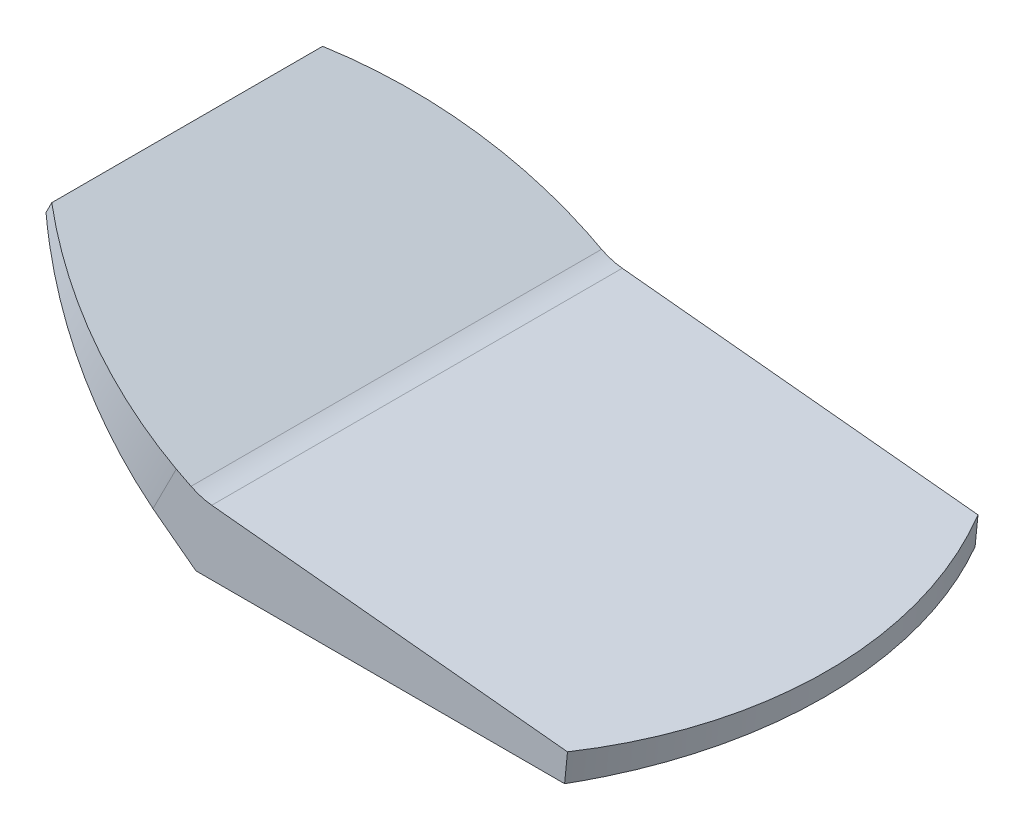
ISO-10303-21;
HEADER;
FILE_DESCRIPTION(('STEP AP214'),'2;1');
FILE_NAME('part.step','',(''),(''),'','','');
FILE_SCHEMA(('AUTOMOTIVE_DESIGN { 1 0 10303 214 1 1 1 1 }'));
ENDSEC;
DATA;
#1=APPLICATION_CONTEXT('core data for automotive mechanical design processes');
#2=APPLICATION_PROTOCOL_DEFINITION('international standard','automotive_design',2000,#1);
#3=PRODUCT_CONTEXT('',#1,'mechanical');
#4=PRODUCT('Part','Part','',(#3));
#5=PRODUCT_RELATED_PRODUCT_CATEGORY('part','',(#4));
#6=PRODUCT_DEFINITION_FORMATION('','',#4);
#7=PRODUCT_DEFINITION_CONTEXT('part definition',#1,'design');
#8=PRODUCT_DEFINITION('design','',#6,#7);
#9=PRODUCT_DEFINITION_SHAPE('','',#8);
#10=(LENGTH_UNIT() NAMED_UNIT(*) SI_UNIT(.MILLI.,.METRE.));
#11=(NAMED_UNIT(*) PLANE_ANGLE_UNIT() SI_UNIT($,.RADIAN.));
#12=(NAMED_UNIT(*) SI_UNIT($,.STERADIAN.) SOLID_ANGLE_UNIT());
#13=UNCERTAINTY_MEASURE_WITH_UNIT(LENGTH_MEASURE(1.E-05),#10,'distance_accuracy_value','');
#14=(GEOMETRIC_REPRESENTATION_CONTEXT(3) GLOBAL_UNCERTAINTY_ASSIGNED_CONTEXT((#13)) GLOBAL_UNIT_ASSIGNED_CONTEXT((#10,
#11,#12)) REPRESENTATION_CONTEXT('',''));
#15=CARTESIAN_POINT('',(0.,0.,0.));
#16=DIRECTION('',(0.,0.,1.));
#17=DIRECTION('',(1.,0.,0.));
#18=AXIS2_PLACEMENT_3D('',#15,#16,#17);
#19=CARTESIAN_POINT('',(526.236430386786,547.410087664511,-177.8));
#20=DIRECTION('',(-0.601809133316664,-0.79863994832255,0.));
#21=DIRECTION('',(0.798639948322551,-0.601809133316664,0.));
#22=AXIS2_PLACEMENT_3D('',#19,#20,#21);
#23=PLANE('',#22);
#24=DIRECTION('',(0.,0.,1.));
#25=VECTOR('',#24,1.);
#26=CARTESIAN_POINT('',(431.053198966608,619.134696642024,-177.8));
#27=LINE('',#26,#25);
#28=CARTESIAN_POINT('',(431.053198966603,619.134696642024,-147.558343712325));
#29=VERTEX_POINT('',#28);
#30=CARTESIAN_POINT('',(431.053198966603,619.134696642024,-30.2416562876749));
#31=VERTEX_POINT('',#30);
#32=EDGE_CURVE('E139',#29,#31,#27,.T.);
#33=ORIENTED_EDGE('',*,*,#32,.F.);
#34=CARTESIAN_POINT('',(510.532632695804,559.243566440573,-4.16472530347642));
#35=DIRECTION('',(-0.601809133316664,-0.79863994832255,0.));
#36=DIRECTION('',(-0.798639948322551,0.601809133316664,0.));
#37=AXIS2_PLACEMENT_3D('',#34,#35,#36);
#38=ELLIPSE('',#37,176.396794445655,173.672363457161);
#39=CARTESIAN_POINT('',(507.621316797172,561.437366664875,-177.8));
#40=VERTEX_POINT('',#39);
#41=EDGE_CURVE('E180',#29,#40,#38,.T.);
#42=ORIENTED_EDGE('',*,*,#41,.T.);
#43=DIRECTION('',(0.79863994832255,-0.601809133316664,0.));
#44=VECTOR('',#43,1.);
#45=CARTESIAN_POINT('',(526.236430386786,547.410087664511,-177.8));
#46=LINE('',#45,#44);
#47=CARTESIAN_POINT('',(526.236430386786,547.410087664511,-177.8));
#48=VERTEX_POINT('',#47);
#49=EDGE_CURVE('E167',#40,#48,#46,.T.);
#50=ORIENTED_EDGE('',*,*,#49,.T.);
#51=DIRECTION('',(0.,0.,1.));
#52=VECTOR('',#51,1.);
#53=CARTESIAN_POINT('',(526.236430386786,547.410087664511,-177.8));
#54=LINE('',#53,#52);
#55=CARTESIAN_POINT('',(526.236430386786,547.410087664511,0.));
#56=VERTEX_POINT('',#55);
#57=EDGE_CURVE('E136',#48,#56,#54,.T.);
#58=ORIENTED_EDGE('',*,*,#57,.T.);
#59=DIRECTION('',(0.79863994832255,-0.601809133316664,0.));
#60=VECTOR('',#59,1.);
#61=CARTESIAN_POINT('',(526.236430386786,547.410087664511,0.));
#62=LINE('',#61,#60);
#63=CARTESIAN_POINT('',(507.621316797171,561.437366664875,0.));
#64=VERTEX_POINT('',#63);
#65=EDGE_CURVE('E120',#64,#56,#62,.T.);
#66=ORIENTED_EDGE('',*,*,#65,.F.);
#67=CARTESIAN_POINT('',(510.532632695804,559.243566440573,-173.635274696524));
#68=DIRECTION('',(-0.601809133316664,-0.79863994832255,0.));
#69=DIRECTION('',(-0.798639948322551,0.601809133316664,0.));
#70=AXIS2_PLACEMENT_3D('',#67,#68,#69);
#71=ELLIPSE('',#70,176.396794445655,173.672363457161);
#72=EDGE_CURVE('E53',#31,#64,#71,.F.);
#73=ORIENTED_EDGE('',*,*,#72,.F.);
#74=EDGE_LOOP('',(#33,#42,#50,#58,#66,#73));
#75=FACE_BOUND('',#74,.T.);
#76=ADVANCED_FACE('F31',(#75),#23,.T.);
#77=CARTESIAN_POINT('',(433.551122257114,624.054848577868,-177.8));
#78=DIRECTION('',(-0.89166676925813,0.45269235977733,0.));
#79=DIRECTION('',(-0.45269235977733,-0.891666769258131,0.));
#80=AXIS2_PLACEMENT_3D('',#77,#78,#79);
#81=PLANE('',#80);
#82=DIRECTION('',(0.,0.,1.));
#83=VECTOR('',#82,1.);
#84=CARTESIAN_POINT('',(433.551122257114,624.054848577868,-177.8));
#85=LINE('',#84,#83);
#86=CARTESIAN_POINT('',(433.551122257114,624.054848577869,-147.558343712329));
#87=VERTEX_POINT('',#86);
#88=CARTESIAN_POINT('',(433.551122257114,624.054848577868,-30.2416562876715));
#89=VERTEX_POINT('',#88);
#90=EDGE_CURVE('E114',#87,#89,#85,.T.);
#91=ORIENTED_EDGE('',*,*,#90,.F.);
#92=DIRECTION('',(0.45269235977723,0.891666769258181,0.));
#93=VECTOR('',#92,1.);
#94=CARTESIAN_POINT('',(413.428946865017,584.420260684355,-147.558343712325));
#95=LINE('',#94,#93);
#96=EDGE_CURVE('E182',#87,#29,#95,.F.);
#97=ORIENTED_EDGE('',*,*,#96,.T.);
#98=ORIENTED_EDGE('',*,*,#32,.T.);
#99=DIRECTION('',(0.45269235977723,0.891666769258181,0.));
#100=VECTOR('',#99,1.);
#101=CARTESIAN_POINT('',(413.428946865017,584.420260684354,-30.2416562876749));
#102=LINE('',#101,#100);
#103=EDGE_CURVE('E115',#89,#31,#102,.F.);
#104=ORIENTED_EDGE('',*,*,#103,.F.);
#105=EDGE_LOOP('',(#91,#97,#98,#104));
#106=FACE_BOUND('',#105,.T.);
#107=ADVANCED_FACE('F189',(#106),#81,.T.);
#108=CARTESIAN_POINT('',(433.551122257114,624.054848577868,-177.8));
#109=DIRECTION('',(0.45269235977723,0.891666769258181,0.));
#110=DIRECTION('',(-0.891666769258181,0.45269235977723,0.));
#111=AXIS2_PLACEMENT_3D('',#108,#109,#110);
#112=PLANE('',#111);
#113=DIRECTION('',(-0.891666769258181,0.45269235977723,0.));
#114=VECTOR('',#113,1.);
#115=CARTESIAN_POINT('',(433.551122257114,624.054848577868,-177.8));
#116=LINE('',#115,#114);
#117=CARTESIAN_POINT('',(524.118132595995,578.074674098129,-177.8));
#118=VERTEX_POINT('',#117);
#119=CARTESIAN_POINT('',(517.717676761276,581.32413629114,-177.8));
#120=VERTEX_POINT('',#119);
#121=EDGE_CURVE('E172',#118,#120,#116,.T.);
#122=ORIENTED_EDGE('',*,*,#121,.T.);
#123=CARTESIAN_POINT('',(520.917904678635,579.699405194635,-4.16472530347642));
#124=DIRECTION('',(0.452692359777231,0.891666769258181,0.));
#125=DIRECTION('',(-0.891666769258181,0.452692359777231,0.));
#126=AXIS2_PLACEMENT_3D('',#123,#124,#125);
#127=CIRCLE('',#126,173.672363457161);
#128=EDGE_CURVE('E45',#120,#87,#127,.T.);
#129=ORIENTED_EDGE('',*,*,#128,.T.);
#130=ORIENTED_EDGE('',*,*,#90,.T.);
#131=CARTESIAN_POINT('',(520.917904678635,579.699405194635,-173.635274696524));
#132=DIRECTION('',(0.452692359777231,0.891666769258181,0.));
#133=DIRECTION('',(-0.891666769258181,0.452692359777231,0.));
#134=AXIS2_PLACEMENT_3D('',#131,#132,#133);
#135=CIRCLE('',#134,173.672363457161);
#136=CARTESIAN_POINT('',(517.717676761276,581.32413629114,0.));
#137=VERTEX_POINT('',#136);
#138=EDGE_CURVE('E100',#137,#89,#135,.F.);
#139=ORIENTED_EDGE('',*,*,#138,.F.);
#140=DIRECTION('',(-0.891666769258181,0.45269235977723,0.));
#141=VECTOR('',#140,1.);
#142=CARTESIAN_POINT('',(433.551122257114,624.054848577868,0.));
#143=LINE('',#142,#141);
#144=CARTESIAN_POINT('',(524.118132595995,578.074674098129,0.));
#145=VERTEX_POINT('',#144);
#146=EDGE_CURVE('E111',#145,#137,#143,.T.);
#147=ORIENTED_EDGE('',*,*,#146,.F.);
#148=DIRECTION('',(0.,0.,1.));
#149=VECTOR('',#148,1.);
#150=CARTESIAN_POINT('',(524.118132595995,578.074674098129,-177.8));
#151=LINE('',#150,#149);
#152=EDGE_CURVE('E143',#118,#145,#151,.T.);
#153=ORIENTED_EDGE('',*,*,#152,.F.);
#154=EDGE_LOOP('',(#122,#129,#130,#139,#147,#153));
#155=FACE_BOUND('',#154,.T.);
#156=ADVANCED_FACE('F110',(#155),#112,.T.);
#157=CARTESIAN_POINT('',(535.616518534336,600.723010037287,-177.8));
#158=DIRECTION('',(0.,0.,1.));
#159=DIRECTION('',(1.,0.,0.));
#160=AXIS2_PLACEMENT_3D('',#157,#158,#159);
#161=PLANE('',#160);
#162=DIRECTION('',(0.45269235977723,0.891666769258181,0.));
#163=VECTOR('',#162,1.);
#164=CARTESIAN_POINT('',(497.595501369177,541.689548397615,-177.8));
#165=LINE('',#164,#163);
#166=EDGE_CURVE('E11',#120,#40,#165,.F.);
#167=ORIENTED_EDGE('',*,*,#166,.F.);
#168=ORIENTED_EDGE('',*,*,#121,.F.);
#169=CARTESIAN_POINT('',(535.616518534336,600.723010037287,-177.8));
#170=DIRECTION('',(0.,0.,-1.));
#171=DIRECTION('',(1.,0.,0.));
#172=AXIS2_PLACEMENT_3D('',#169,#170,#171);
#173=CIRCLE('',#172,25.4);
#174=CARTESIAN_POINT('',(533.082342851816,575.449744446744,-177.8));
#175=VERTEX_POINT('',#174);
#176=EDGE_CURVE('E132',#175,#118,#173,.T.);
#177=ORIENTED_EDGE('',*,*,#176,.F.);
#178=DIRECTION('',(-0.995010456320588,0.0997706961622271,0.));
#179=VECTOR('',#178,1.);
#180=CARTESIAN_POINT('',(533.082342851816,575.449744446744,-177.8));
#181=LINE('',#180,#179);
#182=CARTESIAN_POINT('',(687.173697804214,559.99884977672,-177.8));
#183=VERTEX_POINT('',#182);
#184=EDGE_CURVE('E145',#183,#175,#181,.T.);
#185=ORIENTED_EDGE('',*,*,#184,.F.);
#186=DIRECTION('',(0.0997706961622271,0.995010456320588,0.));
#187=VECTOR('',#186,1.);
#188=CARTESIAN_POINT('',(682.738890359803,515.77063499327,-177.8));
#189=LINE('',#188,#187);
#190=CARTESIAN_POINT('',(685.911410004345,547.410087664511,-177.8));
#191=VERTEX_POINT('',#190);
#192=EDGE_CURVE('E161',#191,#183,#189,.T.);
#193=ORIENTED_EDGE('',*,*,#192,.F.);
#194=DIRECTION('',(1.,0.,0.));
#195=VECTOR('',#194,1.);
#196=CARTESIAN_POINT('',(710.834496509802,547.410087664511,-177.8));
#197=LINE('',#196,#195);
#198=EDGE_CURVE('E160',#48,#191,#197,.T.);
#199=ORIENTED_EDGE('',*,*,#198,.F.);
#200=ORIENTED_EDGE('',*,*,#49,.F.);
#201=EDGE_LOOP('',(#167,#168,#177,#185,#193,#199,#200));
#202=FACE_BOUND('',#201,.T.);
#203=ADVANCED_FACE('F169',(#202),#161,.F.);
#204=CARTESIAN_POINT('',(535.616518534336,600.723010037287,-177.8));
#205=DIRECTION('',(0.,0.,1.));
#206=DIRECTION('',(1.,0.,0.));
#207=AXIS2_PLACEMENT_3D('',#204,#205,#206);
#208=CYLINDRICAL_SURFACE('',#207,25.4);
#209=CARTESIAN_POINT('',(535.616518534336,600.723010037287,0.));
#210=DIRECTION('',(0.,0.,-1.));
#211=DIRECTION('',(1.,0.,0.));
#212=AXIS2_PLACEMENT_3D('',#209,#210,#211);
#213=CIRCLE('',#212,25.4);
#214=CARTESIAN_POINT('',(533.082342851816,575.449744446744,0.));
#215=VERTEX_POINT('',#214);
#216=EDGE_CURVE('E119',#215,#145,#213,.T.);
#217=ORIENTED_EDGE('',*,*,#216,.F.);
#218=DIRECTION('',(0.,0.,1.));
#219=VECTOR('',#218,1.);
#220=CARTESIAN_POINT('',(533.082342851816,575.449744446744,-177.8));
#221=LINE('',#220,#219);
#222=EDGE_CURVE('E133',#175,#215,#221,.T.);
#223=ORIENTED_EDGE('',*,*,#222,.F.);
#224=ORIENTED_EDGE('',*,*,#176,.T.);
#225=ORIENTED_EDGE('',*,*,#152,.T.);
#226=EDGE_LOOP('',(#217,#223,#224,#225));
#227=FACE_BOUND('',#226,.T.);
#228=ADVANCED_FACE('F33',(#227),#208,.F.);
#229=CARTESIAN_POINT('',(533.082342851816,575.449744446744,-177.8));
#230=DIRECTION('',(0.0997706961622271,0.995010456320588,0.));
#231=DIRECTION('',(-0.995010456320588,0.0997706961622271,0.));
#232=AXIS2_PLACEMENT_3D('',#229,#230,#231);
#233=PLANE('',#232);
#234=CARTESIAN_POINT('',(533.082342851816,575.449744446744,-88.9));
#235=DIRECTION('',(-0.0997706961622271,-0.995010456320588,0.));
#236=DIRECTION('',(-0.995010456320588,0.0997706961622271,0.));
#237=AXIS2_PLACEMENT_3D('',#234,#235,#236);
#238=CIRCLE('',#237,178.56675451262);
#239=CARTESIAN_POINT('',(687.173697804214,559.99884977672,0.));
#240=VERTEX_POINT('',#239);
#241=EDGE_CURVE('E152',#183,#240,#238,.T.);
#242=ORIENTED_EDGE('',*,*,#241,.F.);
#243=ORIENTED_EDGE('',*,*,#184,.T.);
#244=ORIENTED_EDGE('',*,*,#222,.T.);
#245=DIRECTION('',(-0.995010456320588,0.0997706961622271,0.));
#246=VECTOR('',#245,1.);
#247=CARTESIAN_POINT('',(533.082342851816,575.449744446744,0.));
#248=LINE('',#247,#246);
#249=EDGE_CURVE('E130',#240,#215,#248,.T.);
#250=ORIENTED_EDGE('',*,*,#249,.F.);
#251=EDGE_LOOP('',(#242,#243,#244,#250));
#252=FACE_BOUND('',#251,.T.);
#253=ADVANCED_FACE('F195',(#252),#233,.T.);
#254=CARTESIAN_POINT('',(710.834496509802,547.410087664511,-177.8));
#255=DIRECTION('',(0.,-1.,0.));
#256=DIRECTION('',(1.,0.,0.));
#257=AXIS2_PLACEMENT_3D('',#254,#255,#256);
#258=PLANE('',#257);
#259=CARTESIAN_POINT('',(530.270778350616,547.410087664511,-88.9));
#260=DIRECTION('',(0.,-1.,0.));
#261=DIRECTION('',(1.,0.,0.));
#262=AXIS2_PLACEMENT_3D('',#259,#260,#261);
#263=ELLIPSE('',#262,179.462188943155,178.56675451262);
#264=CARTESIAN_POINT('',(685.911410004345,547.410087664511,0.));
#265=VERTEX_POINT('',#264);
#266=EDGE_CURVE('E124',#265,#191,#263,.F.);
#267=ORIENTED_EDGE('',*,*,#266,.F.);
#268=DIRECTION('',(1.,0.,0.));
#269=VECTOR('',#268,1.);
#270=CARTESIAN_POINT('',(710.834496509802,547.410087664511,0.));
#271=LINE('',#270,#269);
#272=EDGE_CURVE('E122',#56,#265,#271,.T.);
#273=ORIENTED_EDGE('',*,*,#272,.F.);
#274=ORIENTED_EDGE('',*,*,#57,.F.);
#275=ORIENTED_EDGE('',*,*,#198,.T.);
#276=EDGE_LOOP('',(#267,#273,#274,#275));
#277=FACE_BOUND('',#276,.T.);
#278=ADVANCED_FACE('F157',(#277),#258,.T.);
#279=CARTESIAN_POINT('',(535.616518534336,600.723010037287,0.));
#280=DIRECTION('',(0.,0.,1.));
#281=DIRECTION('',(1.,0.,0.));
#282=AXIS2_PLACEMENT_3D('',#279,#280,#281);
#283=PLANE('',#282);
#284=DIRECTION('',(0.45269235977723,0.891666769258181,0.));
#285=VECTOR('',#284,1.);
#286=CARTESIAN_POINT('',(497.595501369177,541.689548397614,0.));
#287=LINE('',#286,#285);
#288=EDGE_CURVE('E39',#64,#137,#287,.T.);
#289=ORIENTED_EDGE('',*,*,#288,.F.);
#290=ORIENTED_EDGE('',*,*,#65,.T.);
#291=ORIENTED_EDGE('',*,*,#272,.T.);
#292=DIRECTION('',(0.0997706961622271,0.995010456320588,0.));
#293=VECTOR('',#292,1.);
#294=CARTESIAN_POINT('',(682.738890359803,515.77063499327,0.));
#295=LINE('',#294,#293);
#296=EDGE_CURVE('E105',#240,#265,#295,.F.);
#297=ORIENTED_EDGE('',*,*,#296,.F.);
#298=ORIENTED_EDGE('',*,*,#249,.T.);
#299=ORIENTED_EDGE('',*,*,#216,.T.);
#300=ORIENTED_EDGE('',*,*,#146,.T.);
#301=EDGE_LOOP('',(#289,#290,#291,#297,#298,#299,#300));
#302=FACE_BOUND('',#301,.T.);
#303=ADVANCED_FACE('F117',(#302),#283,.T.);
#304=CARTESIAN_POINT('',(528.647535407405,531.221529663294,-88.9));
#305=DIRECTION('',(0.0997706961622271,0.995010456320588,0.));
#306=DIRECTION('',(-0.995010456320588,0.0997706961622271,0.));
#307=AXIS2_PLACEMENT_3D('',#304,#305,#306);
#308=CYLINDRICAL_SURFACE('',#307,178.56675451262);
#309=ORIENTED_EDGE('',*,*,#266,.T.);
#310=ORIENTED_EDGE('',*,*,#192,.T.);
#311=ORIENTED_EDGE('',*,*,#241,.T.);
#312=ORIENTED_EDGE('',*,*,#296,.T.);
#313=EDGE_LOOP('',(#309,#310,#311,#312));
#314=FACE_BOUND('',#313,.T.);
#315=ADVANCED_FACE('F149',(#314),#308,.T.);
#316=CARTESIAN_POINT('',(500.795729286537,540.064817301108,-173.635274696524));
#317=DIRECTION('',(0.45269235977723,0.891666769258181,0.));
#318=DIRECTION('',(-0.891666769258181,0.45269235977723,0.));
#319=AXIS2_PLACEMENT_3D('',#316,#317,#318);
#320=CYLINDRICAL_SURFACE('',#319,173.672363457161);
#321=ORIENTED_EDGE('',*,*,#72,.T.);
#322=ORIENTED_EDGE('',*,*,#288,.T.);
#323=ORIENTED_EDGE('',*,*,#138,.T.);
#324=ORIENTED_EDGE('',*,*,#103,.T.);
#325=EDGE_LOOP('',(#321,#322,#323,#324));
#326=FACE_BOUND('',#325,.T.);
#327=ADVANCED_FACE('F99',(#326),#320,.T.);
#328=CARTESIAN_POINT('',(500.795729286537,540.064817301109,-4.16472530347642));
#329=DIRECTION('',(0.45269235977723,0.891666769258181,0.));
#330=DIRECTION('',(-0.891666769258181,0.45269235977723,0.));
#331=AXIS2_PLACEMENT_3D('',#328,#329,#330);
#332=CYLINDRICAL_SURFACE('',#331,173.672363457161);
#333=ORIENTED_EDGE('',*,*,#96,.F.);
#334=ORIENTED_EDGE('',*,*,#128,.F.);
#335=ORIENTED_EDGE('',*,*,#166,.T.);
#336=ORIENTED_EDGE('',*,*,#41,.F.);
#337=EDGE_LOOP('',(#333,#334,#335,#336));
#338=FACE_BOUND('',#337,.T.);
#339=ADVANCED_FACE('F190',(#338),#332,.T.);
#340=CLOSED_SHELL('',(#76,#107,#156,#203,#228,#253,#278,#303,#315,#327,#339));
#341=MANIFOLD_SOLID_BREP('B2',#340);
#342=ADVANCED_BREP_SHAPE_REPRESENTATION('',(#18,#341),#14);
#343=SHAPE_DEFINITION_REPRESENTATION(#9,#342);
ENDSEC;
END-ISO-10303-21;
